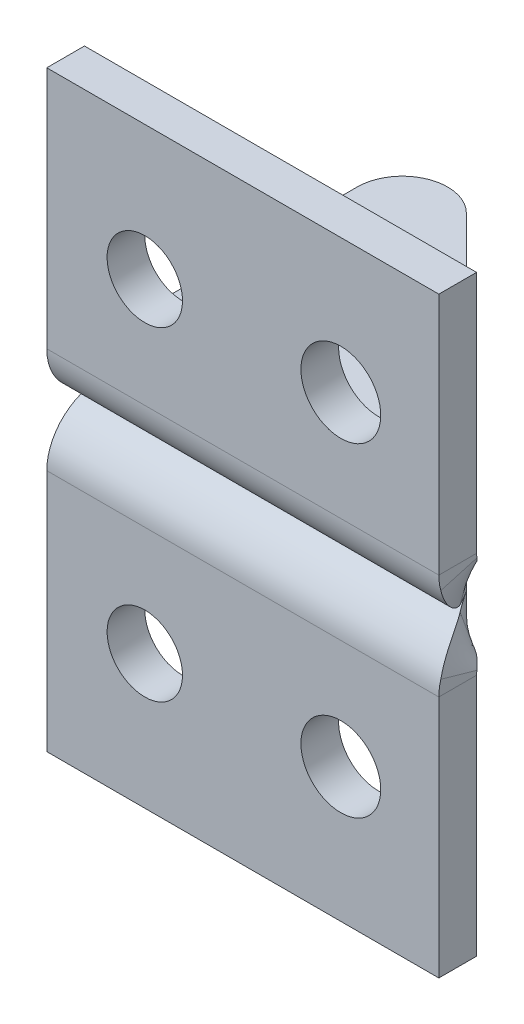
ISO-10303-21;
HEADER;
FILE_DESCRIPTION(('STEP AP214'),'2;1');
FILE_NAME('part.step','',(''),(''),'','','');
FILE_SCHEMA(('AUTOMOTIVE_DESIGN { 1 0 10303 214 1 1 1 1 }'));
ENDSEC;
DATA;
#1=APPLICATION_CONTEXT('core data for automotive mechanical design processes');
#2=APPLICATION_PROTOCOL_DEFINITION('international standard','automotive_design',2000,#1);
#3=PRODUCT_CONTEXT('',#1,'mechanical');
#4=PRODUCT('Part','Part','',(#3));
#5=PRODUCT_RELATED_PRODUCT_CATEGORY('part','',(#4));
#6=PRODUCT_DEFINITION_FORMATION('','',#4);
#7=PRODUCT_DEFINITION_CONTEXT('part definition',#1,'design');
#8=PRODUCT_DEFINITION('design','',#6,#7);
#9=PRODUCT_DEFINITION_SHAPE('','',#8);
#10=(LENGTH_UNIT() NAMED_UNIT(*) SI_UNIT(.MILLI.,.METRE.));
#11=(NAMED_UNIT(*) PLANE_ANGLE_UNIT() SI_UNIT($,.RADIAN.));
#12=(NAMED_UNIT(*) SI_UNIT($,.STERADIAN.) SOLID_ANGLE_UNIT());
#13=UNCERTAINTY_MEASURE_WITH_UNIT(LENGTH_MEASURE(1.E-05),#10,'distance_accuracy_value','');
#14=(GEOMETRIC_REPRESENTATION_CONTEXT(3) GLOBAL_UNCERTAINTY_ASSIGNED_CONTEXT((#13)) GLOBAL_UNIT_ASSIGNED_CONTEXT((#10,
#11,#12)) REPRESENTATION_CONTEXT('',''));
#15=CARTESIAN_POINT('',(0.,0.,0.));
#16=DIRECTION('',(0.,0.,1.));
#17=DIRECTION('',(1.,0.,0.));
#18=AXIS2_PLACEMENT_3D('',#15,#16,#17);
#19=CARTESIAN_POINT('',(5.12132034355964,19.6382637423317,-20.2061241788201));
#20=DIRECTION('',(0.707106781186547,0.,-0.707106781186548));
#21=DIRECTION('',(-0.707106781186548,0.,-0.707106781186547));
#22=AXIS2_PLACEMENT_3D('',#19,#20,#21);
#23=PLANE('',#22);
#24=DIRECTION('',(-0.707106781186548,0.,-0.707106781186547));
#25=VECTOR('',#24,1.);
#26=CARTESIAN_POINT('',(5.12132034355964,17.1382637423317,-20.2061241788201));
#27=LINE('',#26,#25);
#28=CARTESIAN_POINT('',(24.3274445223797,17.1382637423317,-1.));
#29=VERTEX_POINT('',#28);
#30=CARTESIAN_POINT('',(5.12132034355964,17.1382637423317,-20.2061241788201));
#31=VERTEX_POINT('',#30);
#32=EDGE_CURVE('E98',#29,#31,#27,.T.);
#33=ORIENTED_EDGE('',*,*,#32,.T.);
#34=DIRECTION('',(0.,-1.,0.));
#35=VECTOR('',#34,1.);
#36=CARTESIAN_POINT('',(5.12132034355964,19.6382637423317,-20.2061241788201));
#37=LINE('',#36,#35);
#38=CARTESIAN_POINT('',(5.12132034355964,19.6382637423317,-20.2061241788201));
#39=VERTEX_POINT('',#38);
#40=EDGE_CURVE('E93',#39,#31,#37,.T.);
#41=ORIENTED_EDGE('',*,*,#40,.F.);
#42=DIRECTION('',(-0.707106781186548,0.,-0.707106781186547));
#43=VECTOR('',#42,1.);
#44=CARTESIAN_POINT('',(5.12132034355964,19.6382637423317,-20.2061241788201));
#45=LINE('',#44,#43);
#46=CARTESIAN_POINT('',(24.3274445223797,19.6382637423317,-1.));
#47=VERTEX_POINT('',#46);
#48=EDGE_CURVE('E107',#47,#39,#45,.T.);
#49=ORIENTED_EDGE('',*,*,#48,.F.);
#50=CARTESIAN_POINT('',(24.3274445223797,17.1382637423317,-1.));
#51=CARTESIAN_POINT('',(24.3274445223797,19.6382637423317,-1.));
#52=B_SPLINE_CURVE_WITH_KNOTS('',1,(#50,#51),.UNSPECIFIED.,.F.,.F.,(2,2),(0.,1.),.UNSPECIFIED.);
#53=EDGE_CURVE('E112',#29,#47,#52,.T.);
#54=ORIENTED_EDGE('',*,*,#53,.F.);
#55=EDGE_LOOP('',(#33,#41,#49,#54));
#56=FACE_BOUND('',#55,.T.);
#57=ADVANCED_FACE('F49',(#56),#23,.T.);
#58=CARTESIAN_POINT('',(0.,19.6382637423318,18.6725554776202));
#59=DIRECTION('',(-1.,0.,0.));
#60=DIRECTION('',(0.,-1.,0.));
#61=AXIS2_PLACEMENT_3D('',#58,#59,#60);
#62=PLANE('',#61);
#63=DIRECTION('',(0.,0.,1.));
#64=VECTOR('',#63,1.);
#65=CARTESIAN_POINT('',(0.,19.6382637423318,18.6725554776202));
#66=LINE('',#65,#64);
#67=CARTESIAN_POINT('',(0.,19.6382637423317,-18.0848038352605));
#68=VERTEX_POINT('',#67);
#69=CARTESIAN_POINT('',(0.,19.6382637423317,-1.00000000000001));
#70=VERTEX_POINT('',#69);
#71=EDGE_CURVE('E109',#68,#70,#66,.T.);
#72=ORIENTED_EDGE('',*,*,#71,.F.);
#73=DIRECTION('',(0.,-1.,0.));
#74=VECTOR('',#73,1.);
#75=CARTESIAN_POINT('',(0.,19.6382637423317,-18.0848038352605));
#76=LINE('',#75,#74);
#77=CARTESIAN_POINT('',(0.,17.1382637423317,-18.0848038352605));
#78=VERTEX_POINT('',#77);
#79=EDGE_CURVE('E90',#68,#78,#76,.T.);
#80=ORIENTED_EDGE('',*,*,#79,.T.);
#81=DIRECTION('',(0.,0.,1.));
#82=VECTOR('',#81,1.);
#83=CARTESIAN_POINT('',(0.,17.1382637423318,18.6725554776203));
#84=LINE('',#83,#82);
#85=CARTESIAN_POINT('',(0.,17.1382637423317,-0.999999999999999));
#86=VERTEX_POINT('',#85);
#87=EDGE_CURVE('E97',#78,#86,#84,.T.);
#88=ORIENTED_EDGE('',*,*,#87,.T.);
#89=DIRECTION('',(0.,-1.,0.));
#90=VECTOR('',#89,1.);
#91=CARTESIAN_POINT('',(0.,19.6382637423316,-1.00000000000002));
#92=LINE('',#91,#90);
#93=EDGE_CURVE('E12',#70,#86,#92,.T.);
#94=ORIENTED_EDGE('',*,*,#93,.F.);
#95=EDGE_LOOP('',(#72,#80,#88,#94));
#96=FACE_BOUND('',#95,.T.);
#97=ADVANCED_FACE('F51',(#96),#62,.T.);
#98=CARTESIAN_POINT('',(3.,19.6382637423317,-18.0848038352605));
#99=DIRECTION('',(0.,1.,0.));
#100=DIRECTION('',(-1.,0.,0.));
#101=AXIS2_PLACEMENT_3D('',#98,#99,#100);
#102=PLANE('',#101);
#103=ORIENTED_EDGE('',*,*,#48,.T.);
#104=CARTESIAN_POINT('',(3.,19.6382637423317,-18.0848038352605));
#105=DIRECTION('',(0.,1.,0.));
#106=DIRECTION('',(-1.,0.,0.));
#107=AXIS2_PLACEMENT_3D('',#104,#105,#106);
#108=CIRCLE('',#107,3.);
#109=EDGE_CURVE('E74',#39,#68,#108,.T.);
#110=ORIENTED_EDGE('',*,*,#109,.T.);
#111=ORIENTED_EDGE('',*,*,#71,.T.);
#112=DIRECTION('',(-1.,0.,0.));
#113=VECTOR('',#112,1.);
#114=CARTESIAN_POINT('',(3.,19.6382637423317,-1.00000000000002));
#115=LINE('',#114,#113);
#116=EDGE_CURVE('E110',#47,#70,#115,.T.);
#117=ORIENTED_EDGE('',*,*,#116,.F.);
#118=EDGE_LOOP('',(#103,#110,#111,#117));
#119=FACE_BOUND('',#118,.T.);
#120=ADVANCED_FACE('F142',(#119),#102,.T.);
#121=CARTESIAN_POINT('',(3.,19.6382637423317,-18.0848038352605));
#122=DIRECTION('',(0.,-1.,0.));
#123=DIRECTION('',(1.,0.,0.));
#124=AXIS2_PLACEMENT_3D('',#121,#122,#123);
#125=CYLINDRICAL_SURFACE('',#124,3.);
#126=CARTESIAN_POINT('',(3.,17.1382637423317,-18.0848038352605));
#127=DIRECTION('',(0.,1.,0.));
#128=DIRECTION('',(-1.,0.,0.));
#129=AXIS2_PLACEMENT_3D('',#126,#127,#128);
#130=CIRCLE('',#129,3.);
#131=EDGE_CURVE('E86',#31,#78,#130,.T.);
#132=ORIENTED_EDGE('',*,*,#131,.T.);
#133=ORIENTED_EDGE('',*,*,#79,.F.);
#134=ORIENTED_EDGE('',*,*,#109,.F.);
#135=ORIENTED_EDGE('',*,*,#40,.T.);
#136=EDGE_LOOP('',(#132,#133,#134,#135));
#137=FACE_BOUND('',#136,.T.);
#138=ADVANCED_FACE('F88',(#137),#125,.T.);
#139=CARTESIAN_POINT('',(3.,17.1382637423317,-18.0848038352605));
#140=DIRECTION('',(0.,1.,0.));
#141=DIRECTION('',(-1.,0.,0.));
#142=AXIS2_PLACEMENT_3D('',#139,#140,#141);
#143=PLANE('',#142);
#144=DIRECTION('',(-1.,0.,0.));
#145=VECTOR('',#144,1.);
#146=CARTESIAN_POINT('',(3.,17.1382637423317,-0.99999999999999));
#147=LINE('',#146,#145);
#148=EDGE_CURVE('E58',#29,#86,#147,.T.);
#149=ORIENTED_EDGE('',*,*,#148,.T.);
#150=ORIENTED_EDGE('',*,*,#87,.F.);
#151=ORIENTED_EDGE('',*,*,#131,.F.);
#152=ORIENTED_EDGE('',*,*,#32,.F.);
#153=EDGE_LOOP('',(#149,#150,#151,#152));
#154=FACE_BOUND('',#153,.T.);
#155=ADVANCED_FACE('F102',(#154),#143,.F.);
#156=CARTESIAN_POINT('',(26.,0.,2.5));
#157=DIRECTION('',(0.,-1.,0.));
#158=DIRECTION('',(1.,0.,0.));
#159=AXIS2_PLACEMENT_3D('',#156,#157,#158);
#160=PLANE('',#159);
#161=DIRECTION('',(1.,0.,0.));
#162=VECTOR('',#161,1.);
#163=CARTESIAN_POINT('',(26.,0.,0.));
#164=LINE('',#163,#162);
#165=CARTESIAN_POINT('',(0.,0.,0.));
#166=VERTEX_POINT('',#165);
#167=CARTESIAN_POINT('',(26.,0.,0.));
#168=VERTEX_POINT('',#167);
#169=EDGE_CURVE('E251',#166,#168,#164,.T.);
#170=ORIENTED_EDGE('',*,*,#169,.T.);
#171=DIRECTION('',(0.,0.,-1.));
#172=VECTOR('',#171,1.);
#173=CARTESIAN_POINT('',(26.,0.,2.5));
#174=LINE('',#173,#172);
#175=CARTESIAN_POINT('',(26.,0.,2.5));
#176=VERTEX_POINT('',#175);
#177=EDGE_CURVE('E266',#176,#168,#174,.T.);
#178=ORIENTED_EDGE('',*,*,#177,.F.);
#179=DIRECTION('',(1.,0.,0.));
#180=VECTOR('',#179,1.);
#181=CARTESIAN_POINT('',(26.,0.,2.5));
#182=LINE('',#181,#180);
#183=CARTESIAN_POINT('',(0.,0.,2.5));
#184=VERTEX_POINT('',#183);
#185=EDGE_CURVE('E269',#184,#176,#182,.T.);
#186=ORIENTED_EDGE('',*,*,#185,.F.);
#187=DIRECTION('',(0.,0.,-1.));
#188=VECTOR('',#187,1.);
#189=CARTESIAN_POINT('',(0.,0.,2.5));
#190=LINE('',#189,#188);
#191=EDGE_CURVE('E240',#184,#166,#190,.T.);
#192=ORIENTED_EDGE('',*,*,#191,.T.);
#193=EDGE_LOOP('',(#170,#178,#186,#192));
#194=FACE_BOUND('',#193,.T.);
#195=ADVANCED_FACE('F145',(#194),#160,.T.);
#196=CARTESIAN_POINT('',(3.,36.7573593128807,2.5));
#197=DIRECTION('',(0.,0.,1.));
#198=DIRECTION('',(-1.,0.,0.));
#199=AXIS2_PLACEMENT_3D('',#196,#197,#198);
#200=PLANE('',#199);
#201=CARTESIAN_POINT('',(6.5,8.88826374233172,2.5));
#202=DIRECTION('',(0.,0.,-1.));
#203=DIRECTION('',(-1.,0.,0.));
#204=AXIS2_PLACEMENT_3D('',#201,#202,#203);
#205=CIRCLE('',#204,2.5);
#206=CARTESIAN_POINT('',(4.,8.88826374233172,2.5));
#207=VERTEX_POINT('',#206);
#208=EDGE_CURVE('E297',#207,#207,#205,.T.);
#209=ORIENTED_EDGE('',*,*,#208,.T.);
#210=EDGE_LOOP('',(#209));
#211=FACE_BOUND('',#210,.T.);
#212=CARTESIAN_POINT('',(19.5,8.88826374233172,2.5));
#213=DIRECTION('',(0.,0.,-1.));
#214=DIRECTION('',(-1.,0.,0.));
#215=AXIS2_PLACEMENT_3D('',#212,#213,#214);
#216=CIRCLE('',#215,2.64711380543293);
#217=CARTESIAN_POINT('',(16.8528861945671,8.88826374233172,2.5));
#218=VERTEX_POINT('',#217);
#219=EDGE_CURVE('E383',#218,#218,#216,.T.);
#220=ORIENTED_EDGE('',*,*,#219,.T.);
#221=EDGE_LOOP('',(#220));
#222=FACE_BOUND('',#221,.T.);
#223=DIRECTION('',(-1.,0.,0.));
#224=VECTOR('',#223,1.);
#225=CARTESIAN_POINT('',(3.,16.1382637423317,2.5));
#226=LINE('',#225,#224);
#227=CARTESIAN_POINT('',(26.,16.1382637423317,2.5));
#228=VERTEX_POINT('',#227);
#229=CARTESIAN_POINT('',(0.,16.1382637423317,2.5));
#230=VERTEX_POINT('',#229);
#231=EDGE_CURVE('E278',#228,#230,#226,.T.);
#232=ORIENTED_EDGE('',*,*,#231,.T.);
#233=DIRECTION('',(0.,-1.,0.));
#234=VECTOR('',#233,1.);
#235=CARTESIAN_POINT('',(0.,0.,2.5));
#236=LINE('',#235,#234);
#237=EDGE_CURVE('E248',#230,#184,#236,.T.);
#238=ORIENTED_EDGE('',*,*,#237,.T.);
#239=ORIENTED_EDGE('',*,*,#185,.T.);
#240=DIRECTION('',(0.,1.,0.));
#241=VECTOR('',#240,1.);
#242=CARTESIAN_POINT('',(26.,16.7573593128807,2.5));
#243=LINE('',#242,#241);
#244=EDGE_CURVE('E263',#176,#228,#243,.T.);
#245=ORIENTED_EDGE('',*,*,#244,.T.);
#246=EDGE_LOOP('',(#232,#238,#239,#245));
#247=FACE_BOUND('',#246,.T.);
#248=ADVANCED_FACE('F150',(#211,#222,#247),#200,.T.);
#249=CARTESIAN_POINT('',(26.,16.7573593128807,2.5));
#250=DIRECTION('',(1.,0.,0.));
#251=DIRECTION('',(0.,1.,0.));
#252=AXIS2_PLACEMENT_3D('',#249,#250,#251);
#253=PLANE('',#252);
#254=DIRECTION('',(0.,0.,1.));
#255=VECTOR('',#254,1.);
#256=CARTESIAN_POINT('',(26.,16.1382637423317,2.5));
#257=LINE('',#256,#255);
#258=CARTESIAN_POINT('',(26.,16.1382637423317,0.));
#259=VERTEX_POINT('',#258);
#260=EDGE_CURVE('E272',#259,#228,#257,.T.);
#261=ORIENTED_EDGE('',*,*,#260,.T.);
#262=ORIENTED_EDGE('',*,*,#244,.F.);
#263=ORIENTED_EDGE('',*,*,#177,.T.);
#264=DIRECTION('',(0.,1.,0.));
#265=VECTOR('',#264,1.);
#266=CARTESIAN_POINT('',(26.,16.7573593128807,0.));
#267=LINE('',#266,#265);
#268=EDGE_CURVE('E260',#168,#259,#267,.T.);
#269=ORIENTED_EDGE('',*,*,#268,.T.);
#270=EDGE_LOOP('',(#261,#262,#263,#269));
#271=FACE_BOUND('',#270,.T.);
#272=ADVANCED_FACE('F165',(#271),#253,.T.);
#273=CARTESIAN_POINT('',(3.,36.7573593128807,0.));
#274=DIRECTION('',(0.,0.,1.));
#275=DIRECTION('',(-1.,0.,0.));
#276=AXIS2_PLACEMENT_3D('',#273,#274,#275);
#277=PLANE('',#276);
#278=CARTESIAN_POINT('',(6.5,8.88826374233172,0.));
#279=DIRECTION('',(0.,0.,1.));
#280=DIRECTION('',(1.,0.,0.));
#281=AXIS2_PLACEMENT_3D('',#278,#279,#280);
#282=CIRCLE('',#281,2.5);
#283=CARTESIAN_POINT('',(9.,8.88826374233172,0.));
#284=VERTEX_POINT('',#283);
#285=EDGE_CURVE('E386',#284,#284,#282,.T.);
#286=ORIENTED_EDGE('',*,*,#285,.T.);
#287=EDGE_LOOP('',(#286));
#288=FACE_BOUND('',#287,.T.);
#289=CARTESIAN_POINT('',(19.5,8.88826374233172,0.));
#290=DIRECTION('',(0.,0.,1.));
#291=DIRECTION('',(1.,0.,0.));
#292=AXIS2_PLACEMENT_3D('',#289,#290,#291);
#293=CIRCLE('',#292,2.64711380543293);
#294=CARTESIAN_POINT('',(22.1471138054329,8.88826374233172,0.));
#295=VERTEX_POINT('',#294);
#296=EDGE_CURVE('E390',#295,#295,#293,.T.);
#297=ORIENTED_EDGE('',*,*,#296,.T.);
#298=EDGE_LOOP('',(#297));
#299=FACE_BOUND('',#298,.T.);
#300=ORIENTED_EDGE('',*,*,#268,.F.);
#301=ORIENTED_EDGE('',*,*,#169,.F.);
#302=DIRECTION('',(0.,-1.,0.));
#303=VECTOR('',#302,1.);
#304=CARTESIAN_POINT('',(0.,0.,0.));
#305=LINE('',#304,#303);
#306=CARTESIAN_POINT('',(0.,16.1382637423317,0.));
#307=VERTEX_POINT('',#306);
#308=EDGE_CURVE('E254',#307,#166,#305,.T.);
#309=ORIENTED_EDGE('',*,*,#308,.F.);
#310=DIRECTION('',(-1.,0.,0.));
#311=VECTOR('',#310,1.);
#312=CARTESIAN_POINT('',(3.,16.1382637423317,0.));
#313=LINE('',#312,#311);
#314=EDGE_CURVE('E257',#259,#307,#313,.T.);
#315=ORIENTED_EDGE('',*,*,#314,.F.);
#316=EDGE_LOOP('',(#300,#301,#309,#315));
#317=FACE_BOUND('',#316,.T.);
#318=ADVANCED_FACE('F161',(#288,#299,#317),#277,.F.);
#319=CARTESIAN_POINT('',(0.,0.,2.5));
#320=DIRECTION('',(-1.,0.,0.));
#321=DIRECTION('',(0.,0.,-1.));
#322=AXIS2_PLACEMENT_3D('',#319,#320,#321);
#323=PLANE('',#322);
#324=DIRECTION('',(0.,0.,-1.));
#325=VECTOR('',#324,1.);
#326=CARTESIAN_POINT('',(0.,16.1382637423317,2.49999999999989));
#327=LINE('',#326,#325);
#328=EDGE_CURVE('E275',#230,#307,#327,.T.);
#329=ORIENTED_EDGE('',*,*,#328,.T.);
#330=ORIENTED_EDGE('',*,*,#308,.T.);
#331=ORIENTED_EDGE('',*,*,#191,.F.);
#332=ORIENTED_EDGE('',*,*,#237,.F.);
#333=EDGE_LOOP('',(#329,#330,#331,#332));
#334=FACE_BOUND('',#333,.T.);
#335=ADVANCED_FACE('F157',(#334),#323,.T.);
#336=CARTESIAN_POINT('',(24.3274445223797,19.6382637423317,-1.));
#337=CARTESIAN_POINT('',(24.5921480338287,19.6382637423317,-0.588238982190527));
#338=CARTESIAN_POINT('',(24.8566168321107,19.5649416483497,-0.176941275365988));
#339=CARTESIAN_POINT('',(25.1213203435596,19.4226542003039,0.209454141164971));
#340=CARTESIAN_POINT('',(24.3274445223797,17.1382637423317,-1.));
#341=CARTESIAN_POINT('',(24.5920898191726,17.1382637423317,-0.88237986809206));
#342=CARTESIAN_POINT('',(24.8566750467668,17.1173056319296,-0.764816085068257));
#343=CARTESIAN_POINT('',(25.1213203435596,17.0766610160381,-0.654441673952865));
#344=B_SPLINE_SURFACE_WITH_KNOTS('',1,3,((#336,#337,#338,#339),(#340,#341,#342,#343)),
.UNSPECIFIED.,.F.,.F.,.F.,(2,2),(4,4),(0.,1.),(0.,1.),.UNSPECIFIED.);
#345=CARTESIAN_POINT('',(24.3274445223797,19.6382637423317,-1.));
#346=CARTESIAN_POINT('',(24.5921480338287,19.6382637423317,-0.588238982190527));
#347=CARTESIAN_POINT('',(24.8566168321107,19.5649416483497,-0.176941275365988));
#348=CARTESIAN_POINT('',(25.1213203435596,19.4226542003039,0.209454141164971));
#349=B_SPLINE_CURVE_WITH_KNOTS('',3,(#345,#346,#347,#348),.UNSPECIFIED.,.F.,.F.,(4,4),(0.,1.),.UNSPECIFIED.);
#350=CARTESIAN_POINT('',(25.1213203435596,19.4226542003039,0.209454141164971));
#351=VERTEX_POINT('',#350);
#352=EDGE_CURVE('E302',#47,#351,#349,.T.);
#353=CARTESIAN_POINT('',(25.1213203435596,17.0766610160381,-0.654441673952865));
#354=CARTESIAN_POINT('',(25.1213203435596,19.4226542003039,0.209454141164971));
#355=B_SPLINE_CURVE_WITH_KNOTS('',1,(#353,#354),.UNSPECIFIED.,.F.,.F.,(2,2),(0.,1.),.UNSPECIFIED.);
#356=CARTESIAN_POINT('',(25.1213203435596,17.0766610160381,-0.654441673952866));
#357=VERTEX_POINT('',#356);
#358=EDGE_CURVE('E225',#357,#351,#355,.T.);
#359=CARTESIAN_POINT('',(25.1213203435596,17.0766610160381,-0.654441673952865));
#360=CARTESIAN_POINT('',(24.8566750467668,17.1173056319296,-0.764816085068257));
#361=CARTESIAN_POINT('',(24.5920898191726,17.1382637423317,-0.88237986809206));
#362=CARTESIAN_POINT('',(24.3274445223797,17.1382637423317,-1.));
#363=B_SPLINE_CURVE_WITH_KNOTS('',3,(#359,#360,#361,#362),.UNSPECIFIED.,.F.,.F.,(4,4),(0.,1.),.UNSPECIFIED.);
#364=EDGE_CURVE('E353',#29,#357,#363,.F.);
#365=ORIENTED_EDGE('',*,*,#53,.T.);
#366=ORIENTED_EDGE('',*,*,#352,.T.);
#367=ORIENTED_EDGE('',*,*,#358,.F.);
#368=ORIENTED_EDGE('',*,*,#364,.F.);
#369=EDGE_LOOP('',(#365,#366,#367,#368));
#370=FACE_BOUND('',#369,.T.);
#371=ADVANCED_FACE('F160',(#370),#344,.F.);
#372=CARTESIAN_POINT('',(25.1213203435596,19.4226542003039,0.209454141164971));
#373=CARTESIAN_POINT('',(25.366952492039,19.2858772088611,0.580885376360399));
#374=CARTESIAN_POINT('',(25.5645856904341,19.0562802043851,1.00939022168121));
#375=CARTESIAN_POINT('',(25.8574789092475,18.2993791186858,1.80749879178752));
#376=CARTESIAN_POINT('',(25.9535312456767,17.7691441859075,2.17638281305815));
#377=CARTESIAN_POINT('',(26.,17.0891953661614,2.36834218077687));
#378=CARTESIAN_POINT('',(25.1213203435596,17.0766610160381,-0.654441673952865));
#379=CARTESIAN_POINT('',(25.3677576331381,17.0374537807398,-0.547970609764276));
#380=CARTESIAN_POINT('',(25.5645856904341,16.9719827314898,-0.425888508091082));
#381=CARTESIAN_POINT('',(25.8574789092475,16.7557252784329,-0.197857488060708));
#382=CARTESIAN_POINT('',(25.9535437346814,16.6041773707946,-0.0924473130528583));
#383=CARTESIAN_POINT('',(26.,16.4099584919974,-0.0376165197780391));
#384=B_SPLINE_SURFACE_WITH_KNOTS('',1,3,((#372,#373,#374,#375,#376,#377),(#378,#379,#380,#381,
#382,#383)),.UNSPECIFIED.,.F.,.F.,.F.,(2,2),(4,2,4),(0.,1.),(0.,0.5,1.),.UNSPECIFIED.);
#385=CARTESIAN_POINT('',(25.1213203435596,19.4226542003039,0.209454141164971));
#386=CARTESIAN_POINT('',(25.366952492039,19.2858772088611,0.580885376360399));
#387=CARTESIAN_POINT('',(25.5645856904341,19.0562802043851,1.00939022168121));
#388=CARTESIAN_POINT('',(25.8574789092475,18.2993791186858,1.80749879178752));
#389=CARTESIAN_POINT('',(25.9535312456767,17.7691441859075,2.17638281305815));
#390=CARTESIAN_POINT('',(26.,17.0891953661614,2.36834218077687));
#391=B_SPLINE_CURVE_WITH_KNOTS('',3,(#385,#386,#387,#388,#389,#390),.UNSPECIFIED.,.F.,.F.,(4,2,
4),(0.,0.5,1.),.UNSPECIFIED.);
#392=CARTESIAN_POINT('',(26.,17.0891953661614,2.36834218077687));
#393=VERTEX_POINT('',#392);
#394=EDGE_CURVE('E293',#351,#393,#391,.T.);
#395=CARTESIAN_POINT('',(26.,17.0891953661614,2.36834218077687));
#396=CARTESIAN_POINT('',(26.,16.4099584919974,-0.0376165197780391));
#397=B_SPLINE_CURVE_WITH_KNOTS('',1,(#395,#396),.UNSPECIFIED.,.F.,.F.,(2,2),(0.,1.),.UNSPECIFIED.);
#398=CARTESIAN_POINT('',(26.,16.4099584919974,-0.0376165197780384));
#399=VERTEX_POINT('',#398);
#400=EDGE_CURVE('E283',#399,#393,#397,.F.);
#401=CARTESIAN_POINT('',(26.,16.4099584919974,-0.0376165197780391));
#402=CARTESIAN_POINT('',(25.9535437346814,16.6041773707946,-0.0924473130528583));
#403=CARTESIAN_POINT('',(25.8574789092475,16.7557252784329,-0.197857488060708));
#404=CARTESIAN_POINT('',(25.5645856904341,16.9719827314898,-0.425888508091082));
#405=CARTESIAN_POINT('',(25.3677576331381,17.0374537807398,-0.547970609764276));
#406=CARTESIAN_POINT('',(25.1213203435596,17.0766610160381,-0.654441673952865));
#407=B_SPLINE_CURVE_WITH_KNOTS('',3,(#401,#402,#403,#404,#405,#406),.UNSPECIFIED.,.F.,.F.,(4,2,
4),(0.,0.5,1.),.UNSPECIFIED.);
#408=EDGE_CURVE('E306',#357,#399,#407,.F.);
#409=ORIENTED_EDGE('',*,*,#358,.T.);
#410=ORIENTED_EDGE('',*,*,#394,.T.);
#411=ORIENTED_EDGE('',*,*,#400,.F.);
#412=ORIENTED_EDGE('',*,*,#408,.F.);
#413=EDGE_LOOP('',(#409,#410,#411,#412));
#414=FACE_BOUND('',#413,.T.);
#415=ADVANCED_FACE('F183',(#414),#384,.F.);
#416=CARTESIAN_POINT('',(26.,16.1382637423317,-1.));
#417=DIRECTION('',(1.,0.,0.));
#418=DIRECTION('',(0.,0.,1.));
#419=AXIS2_PLACEMENT_3D('',#416,#417,#418);
#420=PLANE('',#419);
#421=ORIENTED_EDGE('',*,*,#400,.T.);
#422=CARTESIAN_POINT('',(26.,16.1382637423317,-1.));
#423=DIRECTION('',(1.,0.,0.));
#424=DIRECTION('',(0.,0.,1.));
#425=AXIS2_PLACEMENT_3D('',#422,#423,#424);
#426=CIRCLE('',#425,3.5);
#427=EDGE_CURVE('E291',#393,#228,#426,.T.);
#428=ORIENTED_EDGE('',*,*,#427,.T.);
#429=ORIENTED_EDGE('',*,*,#260,.F.);
#430=CARTESIAN_POINT('',(26.,16.1382637423317,-1.));
#431=DIRECTION('',(-1.,0.,0.));
#432=DIRECTION('',(0.,0.,1.));
#433=AXIS2_PLACEMENT_3D('',#430,#431,#432);
#434=CIRCLE('',#433,1.);
#435=EDGE_CURVE('E303',#399,#259,#434,.F.);
#436=ORIENTED_EDGE('',*,*,#435,.F.);
#437=EDGE_LOOP('',(#421,#428,#429,#436));
#438=FACE_BOUND('',#437,.T.);
#439=ADVANCED_FACE('F177',(#438),#420,.T.);
#440=CARTESIAN_POINT('',(0.,16.1382637423317,-1.));
#441=DIRECTION('',(-1.,0.,0.));
#442=DIRECTION('',(0.,0.,-1.));
#443=AXIS2_PLACEMENT_3D('',#440,#441,#442);
#444=PLANE('',#443);
#445=CARTESIAN_POINT('',(0.,16.1382637423317,-1.));
#446=DIRECTION('',(-1.,0.,0.));
#447=DIRECTION('',(0.,0.,1.));
#448=AXIS2_PLACEMENT_3D('',#445,#446,#447);
#449=CIRCLE('',#448,1.);
#450=EDGE_CURVE('E299',#307,#86,#449,.T.);
#451=ORIENTED_EDGE('',*,*,#450,.F.);
#452=ORIENTED_EDGE('',*,*,#328,.F.);
#453=CARTESIAN_POINT('',(0.,16.1382637423317,-1.));
#454=DIRECTION('',(-1.,0.,0.));
#455=DIRECTION('',(0.,0.,-1.));
#456=AXIS2_PLACEMENT_3D('',#453,#454,#455);
#457=CIRCLE('',#456,3.5);
#458=EDGE_CURVE('E65',#230,#70,#457,.T.);
#459=ORIENTED_EDGE('',*,*,#458,.T.);
#460=ORIENTED_EDGE('',*,*,#93,.T.);
#461=EDGE_LOOP('',(#451,#452,#459,#460));
#462=FACE_BOUND('',#461,.T.);
#463=ADVANCED_FACE('F173',(#462),#444,.T.);
#464=CARTESIAN_POINT('',(-13.3579441169096,16.1382637423317,-1.));
#465=DIRECTION('',(1.,0.,0.));
#466=DIRECTION('',(0.,0.,1.));
#467=AXIS2_PLACEMENT_3D('',#464,#465,#466);
#468=CYLINDRICAL_SURFACE('',#467,3.5);
#469=ORIENTED_EDGE('',*,*,#231,.F.);
#470=ORIENTED_EDGE('',*,*,#427,.F.);
#471=ORIENTED_EDGE('',*,*,#394,.F.);
#472=ORIENTED_EDGE('',*,*,#352,.F.);
#473=ORIENTED_EDGE('',*,*,#116,.T.);
#474=ORIENTED_EDGE('',*,*,#458,.F.);
#475=EDGE_LOOP('',(#469,#470,#471,#472,#473,#474));
#476=FACE_BOUND('',#475,.T.);
#477=ADVANCED_FACE('F176',(#476),#468,.T.);
#478=CARTESIAN_POINT('',(-13.3579441169096,16.1382637423317,-1.));
#479=DIRECTION('',(1.,0.,0.));
#480=DIRECTION('',(0.,0.,1.));
#481=AXIS2_PLACEMENT_3D('',#478,#479,#480);
#482=CYLINDRICAL_SURFACE('',#481,1.);
#483=ORIENTED_EDGE('',*,*,#314,.T.);
#484=ORIENTED_EDGE('',*,*,#450,.T.);
#485=ORIENTED_EDGE('',*,*,#148,.F.);
#486=ORIENTED_EDGE('',*,*,#364,.T.);
#487=ORIENTED_EDGE('',*,*,#408,.T.);
#488=ORIENTED_EDGE('',*,*,#435,.T.);
#489=EDGE_LOOP('',(#483,#484,#485,#486,#487,#488));
#490=FACE_BOUND('',#489,.T.);
#491=ADVANCED_FACE('F323',(#490),#482,.F.);
#492=CARTESIAN_POINT('',(19.5,8.88826374233172,2.500025));
#493=DIRECTION('',(0.,0.,-1.));
#494=DIRECTION('',(1.,0.,0.));
#495=AXIS2_PLACEMENT_3D('',#492,#493,#494);
#496=CYLINDRICAL_SURFACE('',#495,2.64711380543293);
#497=ORIENTED_EDGE('',*,*,#219,.F.);
#498=EDGE_LOOP('',(#497));
#499=FACE_BOUND('',#498,.T.);
#500=ORIENTED_EDGE('',*,*,#296,.F.);
#501=EDGE_LOOP('',(#500));
#502=FACE_BOUND('',#501,.T.);
#503=ADVANCED_FACE('F325',(#499,#502),#496,.F.);
#504=CARTESIAN_POINT('',(6.5,8.88826374233172,2.500025));
#505=DIRECTION('',(0.,0.,-1.));
#506=DIRECTION('',(1.,0.,0.));
#507=AXIS2_PLACEMENT_3D('',#504,#505,#506);
#508=CYLINDRICAL_SURFACE('',#507,2.5);
#509=ORIENTED_EDGE('',*,*,#208,.F.);
#510=EDGE_LOOP('',(#509));
#511=FACE_BOUND('',#510,.T.);
#512=ORIENTED_EDGE('',*,*,#285,.F.);
#513=EDGE_LOOP('',(#512));
#514=FACE_BOUND('',#513,.T.);
#515=ADVANCED_FACE('F399',(#511,#514),#508,.F.);
#516=CLOSED_SHELL('',(#57,#97,#120,#138,#155,#195,#248,#272,#318,#335,#371,#415,#439,#463,#477,
#491,#503,#515));
#517=MANIFOLD_SOLID_BREP('B2',#516);
#518=CARTESIAN_POINT('',(5.12132034355964,19.6382637423317,-20.2061241788201));
#519=DIRECTION('',(0.707106781186547,0.,-0.707106781186548));
#520=DIRECTION('',(-0.707106781186548,0.,-0.707106781186547));
#521=AXIS2_PLACEMENT_3D('',#518,#519,#520);
#522=PLANE('',#521);
#523=DIRECTION('',(-0.707106781186548,0.,-0.707106781186547));
#524=VECTOR('',#523,1.);
#525=CARTESIAN_POINT('',(5.12132034355964,22.1382637423317,-20.2061241788201));
#526=LINE('',#525,#524);
#527=CARTESIAN_POINT('',(24.3274445223797,22.1382637423317,-1.00000000000002));
#528=VERTEX_POINT('',#527);
#529=CARTESIAN_POINT('',(5.12132034355964,22.1382637423317,-20.2061241788201));
#530=VERTEX_POINT('',#529);
#531=EDGE_CURVE('E668',#528,#530,#526,.T.);
#532=ORIENTED_EDGE('',*,*,#531,.F.);
#533=CARTESIAN_POINT('',(24.3274445223797,19.6382637423317,-1.));
#534=CARTESIAN_POINT('',(24.3274445223797,22.1382637423317,-1.00000000000002));
#535=B_SPLINE_CURVE_WITH_KNOTS('',1,(#533,#534),.UNSPECIFIED.,.F.,.F.,(2,2),(0.,1.),.UNSPECIFIED.);
#536=CARTESIAN_POINT('',(24.3274445223797,19.6382637423317,-1.));
#537=VERTEX_POINT('',#536);
#538=EDGE_CURVE('E688',#528,#537,#535,.F.);
#539=ORIENTED_EDGE('',*,*,#538,.T.);
#540=DIRECTION('',(-0.707106781186548,0.,-0.707106781186547));
#541=VECTOR('',#540,1.);
#542=CARTESIAN_POINT('',(5.12132034355964,19.6382637423317,-20.2061241788201));
#543=LINE('',#542,#541);
#544=CARTESIAN_POINT('',(5.12132034355964,19.6382637423317,-20.2061241788201));
#545=VERTEX_POINT('',#544);
#546=EDGE_CURVE('E680',#537,#545,#543,.T.);
#547=ORIENTED_EDGE('',*,*,#546,.T.);
#548=DIRECTION('',(0.,1.,0.));
#549=VECTOR('',#548,1.);
#550=CARTESIAN_POINT('',(5.12132034355964,19.6382637423317,-20.2061241788201));
#551=LINE('',#550,#549);
#552=EDGE_CURVE('E677',#545,#530,#551,.T.);
#553=ORIENTED_EDGE('',*,*,#552,.T.);
#554=EDGE_LOOP('',(#532,#539,#547,#553));
#555=FACE_BOUND('',#554,.T.);
#556=ADVANCED_FACE('F622',(#555),#522,.T.);
#557=CARTESIAN_POINT('',(0.,19.6382637423318,18.6725554776202));
#558=DIRECTION('',(-1.,0.,0.));
#559=DIRECTION('',(0.,1.,0.));
#560=AXIS2_PLACEMENT_3D('',#557,#558,#559);
#561=PLANE('',#560);
#562=DIRECTION('',(0.,0.,1.));
#563=VECTOR('',#562,1.);
#564=CARTESIAN_POINT('',(0.,19.6382637423318,18.6725554776202));
#565=LINE('',#564,#563);
#566=CARTESIAN_POINT('',(0.,19.6382637423317,-18.0848038352605));
#567=VERTEX_POINT('',#566);
#568=CARTESIAN_POINT('',(0.,19.6382637423317,-1.00000000000001));
#569=VERTEX_POINT('',#568);
#570=EDGE_CURVE('E686',#567,#569,#565,.T.);
#571=ORIENTED_EDGE('',*,*,#570,.T.);
#572=DIRECTION('',(0.,1.,0.));
#573=VECTOR('',#572,1.);
#574=CARTESIAN_POINT('',(0.,19.6382637423319,-1.00000000000002));
#575=LINE('',#574,#573);
#576=CARTESIAN_POINT('',(0.,22.1382637423317,-1.00000000000002));
#577=VERTEX_POINT('',#576);
#578=EDGE_CURVE('E47',#569,#577,#575,.T.);
#579=ORIENTED_EDGE('',*,*,#578,.T.);
#580=DIRECTION('',(0.,0.,1.));
#581=VECTOR('',#580,1.);
#582=CARTESIAN_POINT('',(0.,22.1382637423318,18.6725554776202));
#583=LINE('',#582,#581);
#584=CARTESIAN_POINT('',(0.,22.1382637423317,-18.0848038352605));
#585=VERTEX_POINT('',#584);
#586=EDGE_CURVE('E666',#585,#577,#583,.T.);
#587=ORIENTED_EDGE('',*,*,#586,.F.);
#588=DIRECTION('',(0.,1.,0.));
#589=VECTOR('',#588,1.);
#590=CARTESIAN_POINT('',(0.,19.6382637423317,-18.0848038352605));
#591=LINE('',#590,#589);
#592=EDGE_CURVE('E671',#567,#585,#591,.T.);
#593=ORIENTED_EDGE('',*,*,#592,.F.);
#594=EDGE_LOOP('',(#571,#579,#587,#593));
#595=FACE_BOUND('',#594,.T.);
#596=ADVANCED_FACE('F624',(#595),#561,.T.);
#597=CARTESIAN_POINT('',(3.,19.6382637423317,-18.0848038352605));
#598=DIRECTION('',(0.,-1.,0.));
#599=DIRECTION('',(-1.,0.,0.));
#600=AXIS2_PLACEMENT_3D('',#597,#598,#599);
#601=PLANE('',#600);
#602=ORIENTED_EDGE('',*,*,#546,.F.);
#603=DIRECTION('',(-1.,0.,0.));
#604=VECTOR('',#603,1.);
#605=CARTESIAN_POINT('',(3.,19.6382637423317,-1.00000000000002));
#606=LINE('',#605,#604);
#607=EDGE_CURVE('E676',#537,#569,#606,.T.);
#608=ORIENTED_EDGE('',*,*,#607,.T.);
#609=ORIENTED_EDGE('',*,*,#570,.F.);
#610=CARTESIAN_POINT('',(3.,19.6382637423317,-18.0848038352605));
#611=DIRECTION('',(0.,1.,0.));
#612=DIRECTION('',(-1.,0.,0.));
#613=AXIS2_PLACEMENT_3D('',#610,#611,#612);
#614=CIRCLE('',#613,3.);
#615=EDGE_CURVE('E648',#545,#567,#614,.T.);
#616=ORIENTED_EDGE('',*,*,#615,.F.);
#617=EDGE_LOOP('',(#602,#608,#609,#616));
#618=FACE_BOUND('',#617,.T.);
#619=ADVANCED_FACE('F711',(#618),#601,.T.);
#620=CARTESIAN_POINT('',(3.,19.6382637423317,-18.0848038352605));
#621=DIRECTION('',(0.,1.,0.));
#622=DIRECTION('',(1.,0.,0.));
#623=AXIS2_PLACEMENT_3D('',#620,#621,#622);
#624=CYLINDRICAL_SURFACE('',#623,3.);
#625=CARTESIAN_POINT('',(3.,22.1382637423317,-18.0848038352605));
#626=DIRECTION('',(0.,1.,0.));
#627=DIRECTION('',(-1.,0.,0.));
#628=AXIS2_PLACEMENT_3D('',#625,#626,#627);
#629=CIRCLE('',#628,3.);
#630=EDGE_CURVE('E661',#530,#585,#629,.T.);
#631=ORIENTED_EDGE('',*,*,#630,.F.);
#632=ORIENTED_EDGE('',*,*,#552,.F.);
#633=ORIENTED_EDGE('',*,*,#615,.T.);
#634=ORIENTED_EDGE('',*,*,#592,.T.);
#635=EDGE_LOOP('',(#631,#632,#633,#634));
#636=FACE_BOUND('',#635,.T.);
#637=ADVANCED_FACE('F672',(#636),#624,.T.);
#638=CARTESIAN_POINT('',(3.,22.1382637423317,-18.0848038352605));
#639=DIRECTION('',(0.,-1.,0.));
#640=DIRECTION('',(-1.,0.,0.));
#641=AXIS2_PLACEMENT_3D('',#638,#639,#640);
#642=PLANE('',#641);
#643=DIRECTION('',(-1.,0.,0.));
#644=VECTOR('',#643,1.);
#645=CARTESIAN_POINT('',(3.,22.1382637423317,-1.00000000000001));
#646=LINE('',#645,#644);
#647=EDGE_CURVE('E631',#528,#577,#646,.T.);
#648=ORIENTED_EDGE('',*,*,#647,.F.);
#649=ORIENTED_EDGE('',*,*,#531,.T.);
#650=ORIENTED_EDGE('',*,*,#630,.T.);
#651=ORIENTED_EDGE('',*,*,#586,.T.);
#652=EDGE_LOOP('',(#648,#649,#650,#651));
#653=FACE_BOUND('',#652,.T.);
#654=ADVANCED_FACE('F663',(#653),#642,.F.);
#655=CARTESIAN_POINT('',(26.,39.2765274846635,2.49999999999986));
#656=DIRECTION('',(0.,1.,0.));
#657=DIRECTION('',(1.,0.,0.));
#658=AXIS2_PLACEMENT_3D('',#655,#656,#657);
#659=PLANE('',#658);
#660=DIRECTION('',(1.,0.,0.));
#661=VECTOR('',#660,1.);
#662=CARTESIAN_POINT('',(26.,39.2765274846635,-1.37133262767262E-13));
#663=LINE('',#662,#661);
#664=CARTESIAN_POINT('',(0.,39.2765274846635,-1.37133262767262E-13));
#665=VERTEX_POINT('',#664);
#666=CARTESIAN_POINT('',(26.,39.2765274846635,-1.37133262767262E-13));
#667=VERTEX_POINT('',#666);
#668=EDGE_CURVE('E822',#665,#667,#663,.T.);
#669=ORIENTED_EDGE('',*,*,#668,.F.);
#670=DIRECTION('',(0.,0.,-1.));
#671=VECTOR('',#670,1.);
#672=CARTESIAN_POINT('',(0.,39.2765274846635,2.49999999999986));
#673=LINE('',#672,#671);
#674=CARTESIAN_POINT('',(0.,39.2765274846635,2.49999999999986));
#675=VERTEX_POINT('',#674);
#676=EDGE_CURVE('E811',#675,#665,#673,.T.);
#677=ORIENTED_EDGE('',*,*,#676,.F.);
#678=DIRECTION('',(1.,0.,0.));
#679=VECTOR('',#678,1.);
#680=CARTESIAN_POINT('',(26.,39.2765274846635,2.49999999999986));
#681=LINE('',#680,#679);
#682=CARTESIAN_POINT('',(26.,39.2765274846635,2.49999999999986));
#683=VERTEX_POINT('',#682);
#684=EDGE_CURVE('E840',#675,#683,#681,.T.);
#685=ORIENTED_EDGE('',*,*,#684,.T.);
#686=DIRECTION('',(0.,0.,-1.));
#687=VECTOR('',#686,1.);
#688=CARTESIAN_POINT('',(26.,39.2765274846635,2.49999999999986));
#689=LINE('',#688,#687);
#690=EDGE_CURVE('E837',#683,#667,#689,.T.);
#691=ORIENTED_EDGE('',*,*,#690,.T.);
#692=EDGE_LOOP('',(#669,#677,#685,#691));
#693=FACE_BOUND('',#692,.T.);
#694=ADVANCED_FACE('F714',(#693),#659,.T.);
#695=CARTESIAN_POINT('',(3.00000000000001,2.51916817178276,2.50000000000012));
#696=DIRECTION('',(0.,0.,1.));
#697=DIRECTION('',(-1.,0.,0.));
#698=AXIS2_PLACEMENT_3D('',#695,#696,#697);
#699=PLANE('',#698);
#700=CARTESIAN_POINT('',(19.5,30.3882637423317,2.49999999999992));
#701=DIRECTION('',(0.,0.,-1.));
#702=DIRECTION('',(0.,1.,0.));
#703=AXIS2_PLACEMENT_3D('',#700,#701,#702);
#704=CIRCLE('',#703,2.64711380543293);
#705=CARTESIAN_POINT('',(19.5,33.0353775477647,2.49999999999991));
#706=VERTEX_POINT('',#705);
#707=EDGE_CURVE('E919',#706,#706,#704,.T.);
#708=ORIENTED_EDGE('',*,*,#707,.T.);
#709=EDGE_LOOP('',(#708));
#710=FACE_BOUND('',#709,.T.);
#711=CARTESIAN_POINT('',(6.49999999999999,30.3882637423317,2.49999999999992));
#712=DIRECTION('',(0.,0.,-1.));
#713=DIRECTION('',(0.,1.,0.));
#714=AXIS2_PLACEMENT_3D('',#711,#712,#713);
#715=CIRCLE('',#714,2.5);
#716=CARTESIAN_POINT('',(6.49999999999999,32.8882637423317,2.49999999999991));
#717=VERTEX_POINT('',#716);
#718=EDGE_CURVE('E960',#717,#717,#715,.T.);
#719=ORIENTED_EDGE('',*,*,#718,.T.);
#720=EDGE_LOOP('',(#719));
#721=FACE_BOUND('',#720,.T.);
#722=DIRECTION('',(-1.,0.,0.));
#723=VECTOR('',#722,1.);
#724=CARTESIAN_POINT('',(3.,23.1382637423317,2.49999999999998));
#725=LINE('',#724,#723);
#726=CARTESIAN_POINT('',(26.,23.1382637423317,2.49999999999998));
#727=VERTEX_POINT('',#726);
#728=CARTESIAN_POINT('',(0.,23.1382637423317,2.49999999999998));
#729=VERTEX_POINT('',#728);
#730=EDGE_CURVE('E849',#727,#729,#725,.T.);
#731=ORIENTED_EDGE('',*,*,#730,.F.);
#732=DIRECTION('',(0.,-1.,0.));
#733=VECTOR('',#732,1.);
#734=CARTESIAN_POINT('',(26.,22.5191681717828,2.49999999999998));
#735=LINE('',#734,#733);
#736=EDGE_CURVE('E834',#683,#727,#735,.T.);
#737=ORIENTED_EDGE('',*,*,#736,.F.);
#738=ORIENTED_EDGE('',*,*,#684,.F.);
#739=DIRECTION('',(0.,1.,0.));
#740=VECTOR('',#739,1.);
#741=CARTESIAN_POINT('',(0.,39.2765274846635,2.49999999999986));
#742=LINE('',#741,#740);
#743=EDGE_CURVE('E819',#729,#675,#742,.T.);
#744=ORIENTED_EDGE('',*,*,#743,.F.);
#745=EDGE_LOOP('',(#731,#737,#738,#744));
#746=FACE_BOUND('',#745,.T.);
#747=ADVANCED_FACE('F719',(#710,#721,#746),#699,.T.);
#748=CARTESIAN_POINT('',(26.,22.5191681717828,2.49999999999998));
#749=DIRECTION('',(1.,0.,0.));
#750=DIRECTION('',(0.,-1.,0.));
#751=AXIS2_PLACEMENT_3D('',#748,#749,#750);
#752=PLANE('',#751);
#753=DIRECTION('',(0.,0.,1.));
#754=VECTOR('',#753,1.);
#755=CARTESIAN_POINT('',(26.,23.1382637423317,2.49999999999998));
#756=LINE('',#755,#754);
#757=CARTESIAN_POINT('',(26.,23.1382637423317,0.));
#758=VERTEX_POINT('',#757);
#759=EDGE_CURVE('E843',#758,#727,#756,.T.);
#760=ORIENTED_EDGE('',*,*,#759,.F.);
#761=DIRECTION('',(0.,-1.,0.));
#762=VECTOR('',#761,1.);
#763=CARTESIAN_POINT('',(26.,22.5191681717828,0.));
#764=LINE('',#763,#762);
#765=EDGE_CURVE('E831',#667,#758,#764,.T.);
#766=ORIENTED_EDGE('',*,*,#765,.F.);
#767=ORIENTED_EDGE('',*,*,#690,.F.);
#768=ORIENTED_EDGE('',*,*,#736,.T.);
#769=EDGE_LOOP('',(#760,#766,#767,#768));
#770=FACE_BOUND('',#769,.T.);
#771=ADVANCED_FACE('F735',(#770),#752,.T.);
#772=CARTESIAN_POINT('',(3.00000000000001,2.51916817178274,1.19542005444888E-13));
#773=DIRECTION('',(0.,0.,1.));
#774=DIRECTION('',(-1.,0.,0.));
#775=AXIS2_PLACEMENT_3D('',#772,#773,#774);
#776=PLANE('',#775);
#777=CARTESIAN_POINT('',(19.5,30.3882637423317,0.));
#778=DIRECTION('',(0.,0.,1.));
#779=DIRECTION('',(-1.,0.,0.));
#780=AXIS2_PLACEMENT_3D('',#777,#778,#779);
#781=CIRCLE('',#780,2.64711380543293);
#782=CARTESIAN_POINT('',(16.852886194567,30.3882637423317,0.));
#783=VERTEX_POINT('',#782);
#784=EDGE_CURVE('E963',#783,#783,#781,.T.);
#785=ORIENTED_EDGE('',*,*,#784,.T.);
#786=EDGE_LOOP('',(#785));
#787=FACE_BOUND('',#786,.T.);
#788=CARTESIAN_POINT('',(6.49999999999999,30.3882637423317,0.));
#789=DIRECTION('',(0.,0.,1.));
#790=DIRECTION('',(-1.,0.,0.));
#791=AXIS2_PLACEMENT_3D('',#788,#789,#790);
#792=CIRCLE('',#791,2.5);
#793=CARTESIAN_POINT('',(3.99999999999999,30.3882637423317,0.));
#794=VERTEX_POINT('',#793);
#795=EDGE_CURVE('E967',#794,#794,#792,.T.);
#796=ORIENTED_EDGE('',*,*,#795,.T.);
#797=EDGE_LOOP('',(#796));
#798=FACE_BOUND('',#797,.T.);
#799=ORIENTED_EDGE('',*,*,#765,.T.);
#800=DIRECTION('',(-1.,0.,0.));
#801=VECTOR('',#800,1.);
#802=CARTESIAN_POINT('',(3.,23.1382637423317,0.));
#803=LINE('',#802,#801);
#804=CARTESIAN_POINT('',(0.,23.1382637423317,0.));
#805=VERTEX_POINT('',#804);
#806=EDGE_CURVE('E828',#758,#805,#803,.T.);
#807=ORIENTED_EDGE('',*,*,#806,.T.);
#808=DIRECTION('',(0.,1.,0.));
#809=VECTOR('',#808,1.);
#810=CARTESIAN_POINT('',(0.,39.2765274846635,-1.37133262767262E-13));
#811=LINE('',#810,#809);
#812=EDGE_CURVE('E825',#805,#665,#811,.T.);
#813=ORIENTED_EDGE('',*,*,#812,.T.);
#814=ORIENTED_EDGE('',*,*,#668,.T.);
#815=EDGE_LOOP('',(#799,#807,#813,#814));
#816=FACE_BOUND('',#815,.T.);
#817=ADVANCED_FACE('F731',(#787,#798,#816),#776,.F.);
#818=CARTESIAN_POINT('',(0.,39.2765274846635,2.49999999999986));
#819=DIRECTION('',(-1.,0.,0.));
#820=DIRECTION('',(0.,0.,-1.));
#821=AXIS2_PLACEMENT_3D('',#818,#819,#820);
#822=PLANE('',#821);
#823=DIRECTION('',(0.,0.,-1.));
#824=VECTOR('',#823,1.);
#825=CARTESIAN_POINT('',(0.,23.1382637423317,2.49999999999986));
#826=LINE('',#825,#824);
#827=EDGE_CURVE('E846',#729,#805,#826,.T.);
#828=ORIENTED_EDGE('',*,*,#827,.F.);
#829=ORIENTED_EDGE('',*,*,#743,.T.);
#830=ORIENTED_EDGE('',*,*,#676,.T.);
#831=ORIENTED_EDGE('',*,*,#812,.F.);
#832=EDGE_LOOP('',(#828,#829,#830,#831));
#833=FACE_BOUND('',#832,.T.);
#834=ADVANCED_FACE('F727',(#833),#822,.T.);
#835=CARTESIAN_POINT('',(24.3274445223797,19.6382637423317,-1.));
#836=CARTESIAN_POINT('',(24.5921480338287,19.6382637423317,-0.588238982190527));
#837=CARTESIAN_POINT('',(24.8566168321107,19.7115858363138,-0.176941275365988));
#838=CARTESIAN_POINT('',(25.1213203435596,19.8538732843595,0.209454141164969));
#839=CARTESIAN_POINT('',(24.3274445223797,22.1382637423317,-1.00000000000002));
#840=CARTESIAN_POINT('',(24.5920898191726,22.1382637423317,-0.882379868092077));
#841=CARTESIAN_POINT('',(24.8566750467668,22.1592218527338,-0.764816085068275));
#842=CARTESIAN_POINT('',(25.1213203435596,22.1998664686254,-0.654441673952883));
#843=B_SPLINE_SURFACE_WITH_KNOTS('',1,3,((#835,#836,#837,#838),(#839,#840,#841,#842)),
.UNSPECIFIED.,.F.,.F.,.F.,(2,2),(4,4),(0.,1.),(0.,1.),.UNSPECIFIED.);
#844=CARTESIAN_POINT('',(24.3274445223797,22.1382637423317,-1.00000000000002));
#845=CARTESIAN_POINT('',(24.5920898191726,22.1382637423317,-0.882379868092077));
#846=CARTESIAN_POINT('',(24.8566750467668,22.1592218527338,-0.764816085068275));
#847=CARTESIAN_POINT('',(25.1213203435596,22.1998664686254,-0.654441673952883));
#848=B_SPLINE_CURVE_WITH_KNOTS('',3,(#844,#845,#846,#847),.UNSPECIFIED.,.F.,.F.,(4,4),(0.,1.),.UNSPECIFIED.);
#849=CARTESIAN_POINT('',(25.1213203435596,22.1998664686254,-0.654441673952883));
#850=VERTEX_POINT('',#849);
#851=EDGE_CURVE('E871',#528,#850,#848,.T.);
#852=CARTESIAN_POINT('',(25.1213203435596,22.1998664686254,-0.654441673952883));
#853=CARTESIAN_POINT('',(25.1213203435596,19.8538732843595,0.209454141164969));
#854=B_SPLINE_CURVE_WITH_KNOTS('',1,(#852,#853),.UNSPECIFIED.,.F.,.F.,(2,2),(0.,1.),.UNSPECIFIED.);
#855=CARTESIAN_POINT('',(25.1213203435596,19.8538732843595,0.209454141164969));
#856=VERTEX_POINT('',#855);
#857=EDGE_CURVE('E796',#850,#856,#854,.T.);
#858=CARTESIAN_POINT('',(25.1213203435596,19.8538732843595,0.209454141164969));
#859=CARTESIAN_POINT('',(24.8566168321107,19.7115858363138,-0.176941275365988));
#860=CARTESIAN_POINT('',(24.5921480338287,19.6382637423317,-0.588238982190527));
#861=CARTESIAN_POINT('',(24.3274445223797,19.6382637423317,-1.));
#862=B_SPLINE_CURVE_WITH_KNOTS('',3,(#858,#859,#860,#861),.UNSPECIFIED.,.F.,.F.,(4,4),(0.,1.),.UNSPECIFIED.);
#863=EDGE_CURVE('E865',#537,#856,#862,.F.);
#864=ORIENTED_EDGE('',*,*,#538,.F.);
#865=ORIENTED_EDGE('',*,*,#851,.T.);
#866=ORIENTED_EDGE('',*,*,#857,.T.);
#867=ORIENTED_EDGE('',*,*,#863,.F.);
#868=EDGE_LOOP('',(#864,#865,#866,#867));
#869=FACE_BOUND('',#868,.T.);
#870=ADVANCED_FACE('F730',(#869),#843,.T.);
#871=CARTESIAN_POINT('',(25.1213203435596,19.8538732843595,0.20945414116497));
#872=CARTESIAN_POINT('',(25.366952492039,19.9906502758024,0.580885376360397));
#873=CARTESIAN_POINT('',(25.5645856904341,20.2202472802784,1.00939022168121));
#874=CARTESIAN_POINT('',(25.8574789092475,20.9771483659777,1.80749879178752));
#875=CARTESIAN_POINT('',(25.9535312456767,21.507383298756,2.17638281305814));
#876=CARTESIAN_POINT('',(26.,22.1873321185021,2.36834218077685));
#877=CARTESIAN_POINT('',(25.1213203435596,22.1998664686254,-0.654441673952883));
#878=CARTESIAN_POINT('',(25.3677576331381,22.2390737039237,-0.547970609764295));
#879=CARTESIAN_POINT('',(25.5645856904341,22.3045447531736,-0.425888508091101));
#880=CARTESIAN_POINT('',(25.8574789092475,22.5208022062306,-0.197857488060728));
#881=CARTESIAN_POINT('',(25.9535437346814,22.6723501138689,-0.0924473130528795));
#882=CARTESIAN_POINT('',(26.,22.8665689926661,-0.0376165197780616));
#883=B_SPLINE_SURFACE_WITH_KNOTS('',1,3,((#871,#872,#873,#874,#875,#876),(#877,#878,#879,#880,
#881,#882)),.UNSPECIFIED.,.F.,.F.,.F.,(2,2),(4,2,4),(0.,1.),(0.,0.5,1.),.UNSPECIFIED.);
#884=CARTESIAN_POINT('',(25.1213203435596,22.1998664686254,-0.654441673952883));
#885=CARTESIAN_POINT('',(25.3677576331381,22.2390737039237,-0.547970609764295));
#886=CARTESIAN_POINT('',(25.5645856904341,22.3045447531736,-0.425888508091101));
#887=CARTESIAN_POINT('',(25.8574789092475,22.5208022062306,-0.197857488060728));
#888=CARTESIAN_POINT('',(25.9535437346814,22.6723501138689,-0.0924473130528795));
#889=CARTESIAN_POINT('',(26.,22.8665689926661,-0.0376165197780616));
#890=B_SPLINE_CURVE_WITH_KNOTS('',3,(#884,#885,#886,#887,#888,#889),.UNSPECIFIED.,.F.,.F.,(4,2,
4),(0.,0.5,1.),.UNSPECIFIED.);
#891=CARTESIAN_POINT('',(26.,22.8665689926661,-0.0376165197780609));
#892=VERTEX_POINT('',#891);
#893=EDGE_CURVE('E923',#850,#892,#890,.T.);
#894=CARTESIAN_POINT('',(26.,22.8665689926661,-0.0376165197780616));
#895=CARTESIAN_POINT('',(26.,22.1873321185021,2.36834218077685));
#896=B_SPLINE_CURVE_WITH_KNOTS('',1,(#894,#895),.UNSPECIFIED.,.F.,.F.,(2,2),(0.,1.),.UNSPECIFIED.);
#897=CARTESIAN_POINT('',(26.,22.1873321185021,2.36834218077685));
#898=VERTEX_POINT('',#897);
#899=EDGE_CURVE('E907',#892,#898,#896,.T.);
#900=CARTESIAN_POINT('',(26.,22.1873321185021,2.36834218077685));
#901=CARTESIAN_POINT('',(25.9535312456767,21.507383298756,2.17638281305814));
#902=CARTESIAN_POINT('',(25.8574789092475,20.9771483659777,1.80749879178752));
#903=CARTESIAN_POINT('',(25.5645856904341,20.2202472802784,1.00939022168121));
#904=CARTESIAN_POINT('',(25.366952492039,19.9906502758024,0.580885376360397));
#905=CARTESIAN_POINT('',(25.1213203435596,19.8538732843595,0.20945414116497));
#906=B_SPLINE_CURVE_WITH_KNOTS('',3,(#900,#901,#902,#903,#904,#905),.UNSPECIFIED.,.F.,.F.,(4,2,
4),(0.,0.5,1.),.UNSPECIFIED.);
#907=EDGE_CURVE('E905',#856,#898,#906,.F.);
#908=ORIENTED_EDGE('',*,*,#857,.F.);
#909=ORIENTED_EDGE('',*,*,#893,.T.);
#910=ORIENTED_EDGE('',*,*,#899,.T.);
#911=ORIENTED_EDGE('',*,*,#907,.F.);
#912=EDGE_LOOP('',(#908,#909,#910,#911));
#913=FACE_BOUND('',#912,.T.);
#914=ADVANCED_FACE('F754',(#913),#883,.T.);
#915=CARTESIAN_POINT('',(26.,23.1382637423317,-1.00000000000002));
#916=DIRECTION('',(1.,0.,0.));
#917=DIRECTION('',(0.,0.,1.));
#918=AXIS2_PLACEMENT_3D('',#915,#916,#917);
#919=PLANE('',#918);
#920=ORIENTED_EDGE('',*,*,#899,.F.);
#921=CARTESIAN_POINT('',(26.,23.1382637423317,-1.00000000000002));
#922=DIRECTION('',(1.,0.,0.));
#923=DIRECTION('',(0.,0.,1.));
#924=AXIS2_PLACEMENT_3D('',#921,#922,#923);
#925=CIRCLE('',#924,1.);
#926=EDGE_CURVE('E866',#892,#758,#925,.F.);
#927=ORIENTED_EDGE('',*,*,#926,.T.);
#928=ORIENTED_EDGE('',*,*,#759,.T.);
#929=CARTESIAN_POINT('',(26.,23.1382637423317,-1.00000000000002));
#930=DIRECTION('',(-1.,0.,0.));
#931=DIRECTION('',(0.,0.,1.));
#932=AXIS2_PLACEMENT_3D('',#929,#930,#931);
#933=CIRCLE('',#932,3.5);
#934=EDGE_CURVE('E897',#898,#727,#933,.T.);
#935=ORIENTED_EDGE('',*,*,#934,.F.);
#936=EDGE_LOOP('',(#920,#927,#928,#935));
#937=FACE_BOUND('',#936,.T.);
#938=ADVANCED_FACE('F747',(#937),#919,.T.);
#939=CARTESIAN_POINT('',(0.,23.1382637423317,-1.00000000000002));
#940=DIRECTION('',(-1.,0.,0.));
#941=DIRECTION('',(0.,0.,-1.));
#942=AXIS2_PLACEMENT_3D('',#939,#940,#941);
#943=PLANE('',#942);
#944=CARTESIAN_POINT('',(0.,23.1382637423317,-1.00000000000002));
#945=DIRECTION('',(1.,0.,0.));
#946=DIRECTION('',(0.,0.,1.));
#947=AXIS2_PLACEMENT_3D('',#944,#945,#946);
#948=CIRCLE('',#947,1.);
#949=EDGE_CURVE('E858',#805,#577,#948,.T.);
#950=ORIENTED_EDGE('',*,*,#949,.T.);
#951=ORIENTED_EDGE('',*,*,#578,.F.);
#952=CARTESIAN_POINT('',(0.,23.1382637423317,-1.00000000000002));
#953=DIRECTION('',(1.,0.,0.));
#954=DIRECTION('',(0.,0.,-1.));
#955=AXIS2_PLACEMENT_3D('',#952,#953,#954);
#956=CIRCLE('',#955,3.5);
#957=EDGE_CURVE('E639',#729,#569,#956,.T.);
#958=ORIENTED_EDGE('',*,*,#957,.F.);
#959=ORIENTED_EDGE('',*,*,#827,.T.);
#960=EDGE_LOOP('',(#950,#951,#958,#959));
#961=FACE_BOUND('',#960,.T.);
#962=ADVANCED_FACE('F743',(#961),#943,.T.);
#963=CARTESIAN_POINT('',(-13.3579441169096,23.1382637423317,-1.00000000000002));
#964=DIRECTION('',(1.,0.,0.));
#965=DIRECTION('',(0.,0.,1.));
#966=AXIS2_PLACEMENT_3D('',#963,#964,#965);
#967=CYLINDRICAL_SURFACE('',#966,3.5);
#968=ORIENTED_EDGE('',*,*,#730,.T.);
#969=ORIENTED_EDGE('',*,*,#957,.T.);
#970=ORIENTED_EDGE('',*,*,#607,.F.);
#971=ORIENTED_EDGE('',*,*,#863,.T.);
#972=ORIENTED_EDGE('',*,*,#907,.T.);
#973=ORIENTED_EDGE('',*,*,#934,.T.);
#974=EDGE_LOOP('',(#968,#969,#970,#971,#972,#973));
#975=FACE_BOUND('',#974,.T.);
#976=ADVANCED_FACE('F746',(#975),#967,.T.);
#977=CARTESIAN_POINT('',(-13.3579441169096,23.1382637423317,-1.00000000000002));
#978=DIRECTION('',(1.,0.,0.));
#979=DIRECTION('',(0.,0.,1.));
#980=AXIS2_PLACEMENT_3D('',#977,#978,#979);
#981=CYLINDRICAL_SURFACE('',#980,1.);
#982=ORIENTED_EDGE('',*,*,#806,.F.);
#983=ORIENTED_EDGE('',*,*,#926,.F.);
#984=ORIENTED_EDGE('',*,*,#893,.F.);
#985=ORIENTED_EDGE('',*,*,#851,.F.);
#986=ORIENTED_EDGE('',*,*,#647,.T.);
#987=ORIENTED_EDGE('',*,*,#949,.F.);
#988=EDGE_LOOP('',(#982,#983,#984,#985,#986,#987));
#989=FACE_BOUND('',#988,.T.);
#990=ADVANCED_FACE('F869',(#989),#981,.F.);
#991=CARTESIAN_POINT('',(6.49999999999999,30.3882637423317,2.500025));
#992=DIRECTION('',(0.,0.,-1.));
#993=DIRECTION('',(1.,0.,0.));
#994=AXIS2_PLACEMENT_3D('',#991,#992,#993);
#995=CYLINDRICAL_SURFACE('',#994,2.5);
#996=ORIENTED_EDGE('',*,*,#718,.F.);
#997=EDGE_LOOP('',(#996));
#998=FACE_BOUND('',#997,.T.);
#999=ORIENTED_EDGE('',*,*,#795,.F.);
#1000=EDGE_LOOP('',(#999));
#1001=FACE_BOUND('',#1000,.T.);
#1002=ADVANCED_FACE('F939',(#998,#1001),#995,.F.);
#1003=CARTESIAN_POINT('',(19.5,30.3882637423317,2.500025));
#1004=DIRECTION('',(0.,0.,-1.));
#1005=DIRECTION('',(1.,0.,0.));
#1006=AXIS2_PLACEMENT_3D('',#1003,#1004,#1005);
#1007=CYLINDRICAL_SURFACE('',#1006,2.64711380543293);
#1008=ORIENTED_EDGE('',*,*,#707,.F.);
#1009=EDGE_LOOP('',(#1008));
#1010=FACE_BOUND('',#1009,.T.);
#1011=ORIENTED_EDGE('',*,*,#784,.F.);
#1012=EDGE_LOOP('',(#1011));
#1013=FACE_BOUND('',#1012,.T.);
#1014=ADVANCED_FACE('F976',(#1010,#1013),#1007,.F.);
#1015=CLOSED_SHELL('',(#556,#596,#619,#637,#654,#694,#747,#771,#817,#834,#870,#914,#938,#962,
#976,#990,#1002,#1014));
#1016=MANIFOLD_SOLID_BREP('B6',#1015);
#1017=ADVANCED_BREP_SHAPE_REPRESENTATION('',(#18,#517,#1016),#14);
#1018=SHAPE_DEFINITION_REPRESENTATION(#9,#1017);
ENDSEC;
END-ISO-10303-21;
